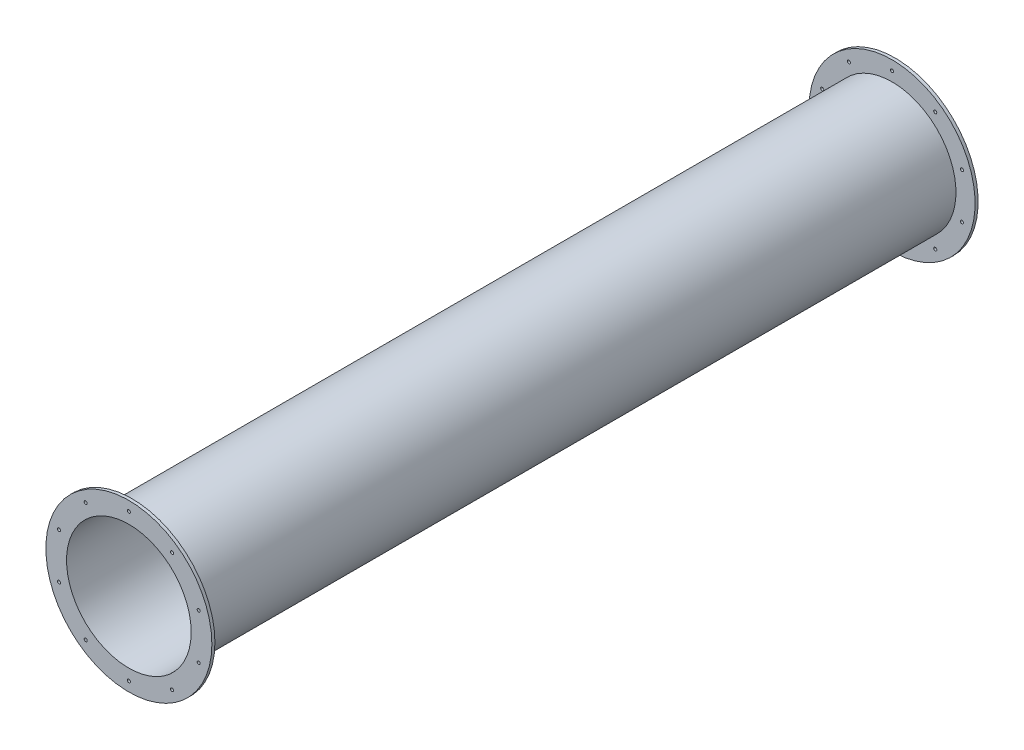
ISO-10303-21;
HEADER;
FILE_DESCRIPTION(('STEP AP214'),'2;1');
FILE_NAME('part.step','',(''),(''),'','','');
FILE_SCHEMA(('AUTOMOTIVE_DESIGN { 1 0 10303 214 1 1 1 1 }'));
ENDSEC;
DATA;
#1=APPLICATION_CONTEXT('core data for automotive mechanical design processes');
#2=APPLICATION_PROTOCOL_DEFINITION('international standard','automotive_design',2000,#1);
#3=PRODUCT_CONTEXT('',#1,'mechanical');
#4=PRODUCT('Part','Part','',(#3));
#5=PRODUCT_RELATED_PRODUCT_CATEGORY('part','',(#4));
#6=PRODUCT_DEFINITION_FORMATION('','',#4);
#7=PRODUCT_DEFINITION_CONTEXT('part definition',#1,'design');
#8=PRODUCT_DEFINITION('design','',#6,#7);
#9=PRODUCT_DEFINITION_SHAPE('','',#8);
#10=(LENGTH_UNIT() NAMED_UNIT(*) SI_UNIT(.MILLI.,.METRE.));
#11=(NAMED_UNIT(*) PLANE_ANGLE_UNIT() SI_UNIT($,.RADIAN.));
#12=(NAMED_UNIT(*) SI_UNIT($,.STERADIAN.) SOLID_ANGLE_UNIT());
#13=UNCERTAINTY_MEASURE_WITH_UNIT(LENGTH_MEASURE(1.E-05),#10,'distance_accuracy_value','');
#14=(GEOMETRIC_REPRESENTATION_CONTEXT(3) GLOBAL_UNCERTAINTY_ASSIGNED_CONTEXT((#13)) GLOBAL_UNIT_ASSIGNED_CONTEXT((#10,
#11,#12)) REPRESENTATION_CONTEXT('',''));
#15=CARTESIAN_POINT('',(0.,0.,0.));
#16=DIRECTION('',(0.,0.,1.));
#17=DIRECTION('',(1.,0.,0.));
#18=AXIS2_PLACEMENT_3D('',#15,#16,#17);
#19=CARTESIAN_POINT('',(0.,0.,3000.));
#20=DIRECTION('',(0.,0.,-1.));
#21=DIRECTION('',(-1.,0.,0.));
#22=AXIS2_PLACEMENT_3D('',#19,#20,#21);
#23=CYLINDRICAL_SURFACE('',#22,250.);
#24=CARTESIAN_POINT('',(0.,0.,2988.));
#25=DIRECTION('',(0.,0.,1.));
#26=DIRECTION('',(1.,0.,0.));
#27=AXIS2_PLACEMENT_3D('',#24,#25,#26);
#28=CIRCLE('',#27,250.);
#29=CARTESIAN_POINT('',(250.,0.,2988.));
#30=VERTEX_POINT('',#29);
#31=EDGE_CURVE('E38',#30,#30,#28,.T.);
#32=ORIENTED_EDGE('',*,*,#31,.F.);
#33=EDGE_LOOP('',(#32));
#34=FACE_BOUND('',#33,.T.);
#35=CARTESIAN_POINT('',(0.,0.,12.));
#36=DIRECTION('',(0.,0.,-1.));
#37=DIRECTION('',(-1.,0.,0.));
#38=AXIS2_PLACEMENT_3D('',#35,#36,#37);
#39=CIRCLE('',#38,250.);
#40=CARTESIAN_POINT('',(-250.,0.,12.));
#41=VERTEX_POINT('',#40);
#42=EDGE_CURVE('E10',#41,#41,#39,.T.);
#43=ORIENTED_EDGE('',*,*,#42,.F.);
#44=EDGE_LOOP('',(#43));
#45=FACE_BOUND('',#44,.T.);
#46=ADVANCED_FACE('F31',(#34,#45),#23,.T.);
#47=CARTESIAN_POINT('',(0.,0.,3000.));
#48=DIRECTION('',(0.,0.,1.));
#49=DIRECTION('',(1.,0.,0.));
#50=AXIS2_PLACEMENT_3D('',#47,#48,#49);
#51=PLANE('',#50);
#52=CARTESIAN_POINT('',(0.,287.5,3000.));
#53=DIRECTION('',(0.,0.,1.));
#54=DIRECTION('',(1.,0.,0.));
#55=AXIS2_PLACEMENT_3D('',#52,#53,#54);
#56=CIRCLE('',#55,6.00000000000001);
#57=CARTESIAN_POINT('',(6.00000000000001,287.5,3000.));
#58=VERTEX_POINT('',#57);
#59=EDGE_CURVE('E255',#58,#58,#56,.T.);
#60=ORIENTED_EDGE('',*,*,#59,.F.);
#61=EDGE_LOOP('',(#60));
#62=FACE_BOUND('',#61,.T.);
#63=CARTESIAN_POINT('',(-168.988260034086,232.592385882797,3000.));
#64=DIRECTION('',(0.,0.,1.));
#65=DIRECTION('',(1.,0.,0.));
#66=AXIS2_PLACEMENT_3D('',#63,#64,#65);
#67=CIRCLE('',#66,6.00000000000002);
#68=CARTESIAN_POINT('',(-162.988260034086,232.592385882797,3000.));
#69=VERTEX_POINT('',#68);
#70=EDGE_CURVE('E263',#69,#69,#67,.T.);
#71=ORIENTED_EDGE('',*,*,#70,.F.);
#72=EDGE_LOOP('',(#71));
#73=FACE_BOUND('',#72,.T.);
#74=CARTESIAN_POINT('',(-273.428748434856,88.8423858827975,3000.));
#75=DIRECTION('',(0.,0.,1.));
#76=DIRECTION('',(1.,0.,0.));
#77=AXIS2_PLACEMENT_3D('',#74,#75,#76);
#78=CIRCLE('',#77,5.99999999999999);
#79=CARTESIAN_POINT('',(-267.428748434856,88.8423858827975,3000.));
#80=VERTEX_POINT('',#79);
#81=EDGE_CURVE('E304',#80,#80,#78,.T.);
#82=ORIENTED_EDGE('',*,*,#81,.F.);
#83=EDGE_LOOP('',(#82));
#84=FACE_BOUND('',#83,.T.);
#85=CARTESIAN_POINT('',(-273.428748434856,-88.8423858827971,3000.));
#86=DIRECTION('',(0.,0.,1.));
#87=DIRECTION('',(1.,0.,0.));
#88=AXIS2_PLACEMENT_3D('',#85,#86,#87);
#89=CIRCLE('',#88,5.99999999999999);
#90=CARTESIAN_POINT('',(-267.428748434856,-88.8423858827971,3000.));
#91=VERTEX_POINT('',#90);
#92=EDGE_CURVE('E298',#91,#91,#89,.T.);
#93=ORIENTED_EDGE('',*,*,#92,.F.);
#94=EDGE_LOOP('',(#93));
#95=FACE_BOUND('',#94,.T.);
#96=CARTESIAN_POINT('',(-168.988260034086,-232.592385882797,3000.));
#97=DIRECTION('',(0.,0.,1.));
#98=DIRECTION('',(1.,0.,0.));
#99=AXIS2_PLACEMENT_3D('',#96,#97,#98);
#100=CIRCLE('',#99,6.00000000000002);
#101=CARTESIAN_POINT('',(-162.988260034086,-232.592385882797,3000.));
#102=VERTEX_POINT('',#101);
#103=EDGE_CURVE('E292',#102,#102,#100,.T.);
#104=ORIENTED_EDGE('',*,*,#103,.F.);
#105=EDGE_LOOP('',(#104));
#106=FACE_BOUND('',#105,.T.);
#107=CARTESIAN_POINT('',(2.19318203764714E-13,-287.499999999999,3000.));
#108=DIRECTION('',(0.,0.,1.));
#109=DIRECTION('',(1.,0.,0.));
#110=AXIS2_PLACEMENT_3D('',#107,#108,#109);
#111=CIRCLE('',#110,6.00000000000001);
#112=CARTESIAN_POINT('',(6.00000000000023,-287.499999999999,3000.));
#113=VERTEX_POINT('',#112);
#114=EDGE_CURVE('E286',#113,#113,#111,.T.);
#115=ORIENTED_EDGE('',*,*,#114,.F.);
#116=EDGE_LOOP('',(#115));
#117=FACE_BOUND('',#116,.T.);
#118=CARTESIAN_POINT('',(168.988260034086,-232.592385882797,3000.));
#119=DIRECTION('',(0.,0.,1.));
#120=DIRECTION('',(1.,0.,0.));
#121=AXIS2_PLACEMENT_3D('',#118,#119,#120);
#122=CIRCLE('',#121,6.00000000000002);
#123=CARTESIAN_POINT('',(174.988260034086,-232.592385882797,3000.));
#124=VERTEX_POINT('',#123);
#125=EDGE_CURVE('E280',#124,#124,#122,.T.);
#126=ORIENTED_EDGE('',*,*,#125,.F.);
#127=EDGE_LOOP('',(#126));
#128=FACE_BOUND('',#127,.T.);
#129=CARTESIAN_POINT('',(273.428748434856,-88.8423858827968,3000.));
#130=DIRECTION('',(0.,0.,1.));
#131=DIRECTION('',(1.,0.,0.));
#132=AXIS2_PLACEMENT_3D('',#129,#130,#131);
#133=CIRCLE('',#132,5.99999999999999);
#134=CARTESIAN_POINT('',(279.428748434856,-88.8423858827968,3000.));
#135=VERTEX_POINT('',#134);
#136=EDGE_CURVE('E274',#135,#135,#133,.T.);
#137=ORIENTED_EDGE('',*,*,#136,.F.);
#138=EDGE_LOOP('',(#137));
#139=FACE_BOUND('',#138,.T.);
#140=CARTESIAN_POINT('',(273.428748434856,88.8423858827977,3000.));
#141=DIRECTION('',(0.,0.,1.));
#142=DIRECTION('',(1.,0.,0.));
#143=AXIS2_PLACEMENT_3D('',#140,#141,#142);
#144=CIRCLE('',#143,5.99999999999999);
#145=CARTESIAN_POINT('',(279.428748434856,88.8423858827977,3000.));
#146=VERTEX_POINT('',#145);
#147=EDGE_CURVE('E268',#146,#146,#144,.T.);
#148=ORIENTED_EDGE('',*,*,#147,.F.);
#149=EDGE_LOOP('',(#148));
#150=FACE_BOUND('',#149,.T.);
#151=CARTESIAN_POINT('',(168.988260034086,232.592385882797,3000.));
#152=DIRECTION('',(0.,0.,1.));
#153=DIRECTION('',(1.,0.,0.));
#154=AXIS2_PLACEMENT_3D('',#151,#152,#153);
#155=CIRCLE('',#154,6.00000000000002);
#156=CARTESIAN_POINT('',(174.988260034086,232.592385882797,3000.));
#157=VERTEX_POINT('',#156);
#158=EDGE_CURVE('E256',#157,#157,#155,.T.);
#159=ORIENTED_EDGE('',*,*,#158,.F.);
#160=EDGE_LOOP('',(#159));
#161=FACE_BOUND('',#160,.T.);
#162=CARTESIAN_POINT('',(0.,0.,3000.));
#163=DIRECTION('',(0.,0.,1.));
#164=DIRECTION('',(1.,0.,0.));
#165=AXIS2_PLACEMENT_3D('',#162,#163,#164);
#166=CIRCLE('',#165,244.);
#167=CARTESIAN_POINT('',(244.,0.,3000.));
#168=VERTEX_POINT('',#167);
#169=EDGE_CURVE('E43',#168,#168,#166,.T.);
#170=ORIENTED_EDGE('',*,*,#169,.F.);
#171=EDGE_LOOP('',(#170));
#172=FACE_BOUND('',#171,.T.);
#173=CARTESIAN_POINT('',(0.,0.,3000.));
#174=DIRECTION('',(0.,0.,1.));
#175=DIRECTION('',(1.,0.,0.));
#176=AXIS2_PLACEMENT_3D('',#173,#174,#175);
#177=CIRCLE('',#176,325.);
#178=CARTESIAN_POINT('',(325.,0.,3000.));
#179=VERTEX_POINT('',#178);
#180=EDGE_CURVE('E100',#179,#179,#177,.T.);
#181=ORIENTED_EDGE('',*,*,#180,.T.);
#182=EDGE_LOOP('',(#181));
#183=FACE_BOUND('',#182,.T.);
#184=ADVANCED_FACE('F128',(#62,#73,#84,#95,#106,#117,#128,#139,#150,#161,#172,#183),#51,.T.);
#185=CARTESIAN_POINT('',(0.,0.,0.));
#186=DIRECTION('',(0.,0.,1.));
#187=DIRECTION('',(1.,0.,0.));
#188=AXIS2_PLACEMENT_3D('',#185,#186,#187);
#189=PLANE('',#188);
#190=CARTESIAN_POINT('',(0.,287.5,0.));
#191=DIRECTION('',(0.,0.,1.));
#192=DIRECTION('',(1.,0.,0.));
#193=AXIS2_PLACEMENT_3D('',#190,#191,#192);
#194=CIRCLE('',#193,6.00000000000001);
#195=CARTESIAN_POINT('',(6.00000000000001,287.5,0.));
#196=VERTEX_POINT('',#195);
#197=EDGE_CURVE('E51',#196,#196,#194,.T.);
#198=ORIENTED_EDGE('',*,*,#197,.T.);
#199=EDGE_LOOP('',(#198));
#200=FACE_BOUND('',#199,.T.);
#201=CARTESIAN_POINT('',(-168.988260034086,232.592385882797,0.));
#202=DIRECTION('',(0.,0.,1.));
#203=DIRECTION('',(1.,0.,0.));
#204=AXIS2_PLACEMENT_3D('',#201,#202,#203);
#205=CIRCLE('',#204,6.00000000000002);
#206=CARTESIAN_POINT('',(-162.988260034086,232.592385882797,0.));
#207=VERTEX_POINT('',#206);
#208=EDGE_CURVE('E307',#207,#207,#205,.T.);
#209=ORIENTED_EDGE('',*,*,#208,.T.);
#210=EDGE_LOOP('',(#209));
#211=FACE_BOUND('',#210,.T.);
#212=CARTESIAN_POINT('',(-273.428748434856,88.8423858827975,0.));
#213=DIRECTION('',(0.,0.,1.));
#214=DIRECTION('',(1.,0.,0.));
#215=AXIS2_PLACEMENT_3D('',#212,#213,#214);
#216=CIRCLE('',#215,5.99999999999999);
#217=CARTESIAN_POINT('',(-267.428748434856,88.8423858827975,0.));
#218=VERTEX_POINT('',#217);
#219=EDGE_CURVE('E301',#218,#218,#216,.T.);
#220=ORIENTED_EDGE('',*,*,#219,.T.);
#221=EDGE_LOOP('',(#220));
#222=FACE_BOUND('',#221,.T.);
#223=CARTESIAN_POINT('',(-273.428748434856,-88.8423858827971,0.));
#224=DIRECTION('',(0.,0.,1.));
#225=DIRECTION('',(1.,0.,0.));
#226=AXIS2_PLACEMENT_3D('',#223,#224,#225);
#227=CIRCLE('',#226,5.99999999999999);
#228=CARTESIAN_POINT('',(-267.428748434856,-88.8423858827971,0.));
#229=VERTEX_POINT('',#228);
#230=EDGE_CURVE('E295',#229,#229,#227,.T.);
#231=ORIENTED_EDGE('',*,*,#230,.T.);
#232=EDGE_LOOP('',(#231));
#233=FACE_BOUND('',#232,.T.);
#234=CARTESIAN_POINT('',(-168.988260034086,-232.592385882797,0.));
#235=DIRECTION('',(0.,0.,1.));
#236=DIRECTION('',(1.,0.,0.));
#237=AXIS2_PLACEMENT_3D('',#234,#235,#236);
#238=CIRCLE('',#237,6.00000000000002);
#239=CARTESIAN_POINT('',(-162.988260034086,-232.592385882797,0.));
#240=VERTEX_POINT('',#239);
#241=EDGE_CURVE('E289',#240,#240,#238,.T.);
#242=ORIENTED_EDGE('',*,*,#241,.T.);
#243=EDGE_LOOP('',(#242));
#244=FACE_BOUND('',#243,.T.);
#245=CARTESIAN_POINT('',(2.19318203764714E-13,-287.499999999999,0.));
#246=DIRECTION('',(0.,0.,1.));
#247=DIRECTION('',(1.,0.,0.));
#248=AXIS2_PLACEMENT_3D('',#245,#246,#247);
#249=CIRCLE('',#248,6.00000000000001);
#250=CARTESIAN_POINT('',(6.00000000000023,-287.499999999999,0.));
#251=VERTEX_POINT('',#250);
#252=EDGE_CURVE('E283',#251,#251,#249,.T.);
#253=ORIENTED_EDGE('',*,*,#252,.T.);
#254=EDGE_LOOP('',(#253));
#255=FACE_BOUND('',#254,.T.);
#256=CARTESIAN_POINT('',(168.988260034086,-232.592385882797,0.));
#257=DIRECTION('',(0.,0.,1.));
#258=DIRECTION('',(1.,0.,0.));
#259=AXIS2_PLACEMENT_3D('',#256,#257,#258);
#260=CIRCLE('',#259,6.00000000000002);
#261=CARTESIAN_POINT('',(174.988260034086,-232.592385882797,0.));
#262=VERTEX_POINT('',#261);
#263=EDGE_CURVE('E277',#262,#262,#260,.T.);
#264=ORIENTED_EDGE('',*,*,#263,.T.);
#265=EDGE_LOOP('',(#264));
#266=FACE_BOUND('',#265,.T.);
#267=CARTESIAN_POINT('',(273.428748434856,-88.8423858827968,0.));
#268=DIRECTION('',(0.,0.,1.));
#269=DIRECTION('',(1.,0.,0.));
#270=AXIS2_PLACEMENT_3D('',#267,#268,#269);
#271=CIRCLE('',#270,5.99999999999999);
#272=CARTESIAN_POINT('',(279.428748434856,-88.8423858827968,0.));
#273=VERTEX_POINT('',#272);
#274=EDGE_CURVE('E271',#273,#273,#271,.T.);
#275=ORIENTED_EDGE('',*,*,#274,.T.);
#276=EDGE_LOOP('',(#275));
#277=FACE_BOUND('',#276,.T.);
#278=CARTESIAN_POINT('',(273.428748434856,88.8423858827977,0.));
#279=DIRECTION('',(0.,0.,1.));
#280=DIRECTION('',(1.,0.,0.));
#281=AXIS2_PLACEMENT_3D('',#278,#279,#280);
#282=CIRCLE('',#281,5.99999999999999);
#283=CARTESIAN_POINT('',(279.428748434856,88.8423858827977,0.));
#284=VERTEX_POINT('',#283);
#285=EDGE_CURVE('E260',#284,#284,#282,.T.);
#286=ORIENTED_EDGE('',*,*,#285,.T.);
#287=EDGE_LOOP('',(#286));
#288=FACE_BOUND('',#287,.T.);
#289=CARTESIAN_POINT('',(168.988260034086,232.592385882797,0.));
#290=DIRECTION('',(0.,0.,1.));
#291=DIRECTION('',(1.,0.,0.));
#292=AXIS2_PLACEMENT_3D('',#289,#290,#291);
#293=CIRCLE('',#292,6.00000000000002);
#294=CARTESIAN_POINT('',(174.988260034086,232.592385882797,0.));
#295=VERTEX_POINT('',#294);
#296=EDGE_CURVE('E253',#295,#295,#293,.T.);
#297=ORIENTED_EDGE('',*,*,#296,.T.);
#298=EDGE_LOOP('',(#297));
#299=FACE_BOUND('',#298,.T.);
#300=CARTESIAN_POINT('',(0.,0.,0.));
#301=DIRECTION('',(0.,0.,1.));
#302=DIRECTION('',(1.,0.,0.));
#303=AXIS2_PLACEMENT_3D('',#300,#301,#302);
#304=CIRCLE('',#303,244.);
#305=CARTESIAN_POINT('',(244.,0.,0.));
#306=VERTEX_POINT('',#305);
#307=EDGE_CURVE('E106',#306,#306,#304,.T.);
#308=ORIENTED_EDGE('',*,*,#307,.T.);
#309=EDGE_LOOP('',(#308));
#310=FACE_BOUND('',#309,.T.);
#311=CARTESIAN_POINT('',(0.,0.,0.));
#312=DIRECTION('',(0.,0.,-1.));
#313=DIRECTION('',(-1.,0.,0.));
#314=AXIS2_PLACEMENT_3D('',#311,#312,#313);
#315=CIRCLE('',#314,325.);
#316=CARTESIAN_POINT('',(-325.,0.,0.));
#317=VERTEX_POINT('',#316);
#318=EDGE_CURVE('E96',#317,#317,#315,.T.);
#319=ORIENTED_EDGE('',*,*,#318,.T.);
#320=EDGE_LOOP('',(#319));
#321=FACE_BOUND('',#320,.T.);
#322=ADVANCED_FACE('F113',(#200,#211,#222,#233,#244,#255,#266,#277,#288,#299,#310,#321),#189,.F.);
#323=CARTESIAN_POINT('',(0.,0.,3000.));
#324=DIRECTION('',(0.,0.,-1.));
#325=DIRECTION('',(-1.,0.,0.));
#326=AXIS2_PLACEMENT_3D('',#323,#324,#325);
#327=CYLINDRICAL_SURFACE('',#326,244.);
#328=ORIENTED_EDGE('',*,*,#169,.T.);
#329=EDGE_LOOP('',(#328));
#330=FACE_BOUND('',#329,.T.);
#331=ORIENTED_EDGE('',*,*,#307,.F.);
#332=EDGE_LOOP('',(#331));
#333=FACE_BOUND('',#332,.T.);
#334=ADVANCED_FACE('F116',(#330,#333),#327,.F.);
#335=CARTESIAN_POINT('',(0.,0.,2988.));
#336=DIRECTION('',(0.,0.,1.));
#337=DIRECTION('',(1.,0.,0.));
#338=AXIS2_PLACEMENT_3D('',#335,#336,#337);
#339=CYLINDRICAL_SURFACE('',#338,325.);
#340=CARTESIAN_POINT('',(0.,0.,2988.));
#341=DIRECTION('',(0.,0.,1.));
#342=DIRECTION('',(1.,0.,0.));
#343=AXIS2_PLACEMENT_3D('',#340,#341,#342);
#344=CIRCLE('',#343,325.);
#345=CARTESIAN_POINT('',(325.,0.,2988.));
#346=VERTEX_POINT('',#345);
#347=EDGE_CURVE('E103',#346,#346,#344,.T.);
#348=ORIENTED_EDGE('',*,*,#347,.T.);
#349=EDGE_LOOP('',(#348));
#350=FACE_BOUND('',#349,.T.);
#351=ORIENTED_EDGE('',*,*,#180,.F.);
#352=EDGE_LOOP('',(#351));
#353=FACE_BOUND('',#352,.T.);
#354=ADVANCED_FACE('F118',(#350,#353),#339,.T.);
#355=CARTESIAN_POINT('',(0.,0.,2988.));
#356=DIRECTION('',(0.,0.,1.));
#357=DIRECTION('',(1.,0.,0.));
#358=AXIS2_PLACEMENT_3D('',#355,#356,#357);
#359=PLANE('',#358);
#360=CARTESIAN_POINT('',(0.,287.5,2988.));
#361=DIRECTION('',(0.,0.,1.));
#362=DIRECTION('',(1.,0.,0.));
#363=AXIS2_PLACEMENT_3D('',#360,#361,#362);
#364=CIRCLE('',#363,6.00000000000001);
#365=CARTESIAN_POINT('',(6.00000000000001,287.5,2988.));
#366=VERTEX_POINT('',#365);
#367=EDGE_CURVE('E93',#366,#366,#364,.T.);
#368=ORIENTED_EDGE('',*,*,#367,.T.);
#369=EDGE_LOOP('',(#368));
#370=FACE_BOUND('',#369,.T.);
#371=CARTESIAN_POINT('',(-168.988260034086,232.592385882797,2988.));
#372=DIRECTION('',(0.,0.,1.));
#373=DIRECTION('',(1.,0.,0.));
#374=AXIS2_PLACEMENT_3D('',#371,#372,#373);
#375=CIRCLE('',#374,6.00000000000002);
#376=CARTESIAN_POINT('',(-162.988260034086,232.592385882797,2988.));
#377=VERTEX_POINT('',#376);
#378=EDGE_CURVE('E81',#377,#377,#375,.T.);
#379=ORIENTED_EDGE('',*,*,#378,.T.);
#380=EDGE_LOOP('',(#379));
#381=FACE_BOUND('',#380,.T.);
#382=CARTESIAN_POINT('',(-273.428748434856,88.8423858827975,2988.));
#383=DIRECTION('',(0.,0.,1.));
#384=DIRECTION('',(1.,0.,0.));
#385=AXIS2_PLACEMENT_3D('',#382,#383,#384);
#386=CIRCLE('',#385,5.99999999999999);
#387=CARTESIAN_POINT('',(-267.428748434856,88.8423858827975,2988.));
#388=VERTEX_POINT('',#387);
#389=EDGE_CURVE('E78',#388,#388,#386,.T.);
#390=ORIENTED_EDGE('',*,*,#389,.T.);
#391=EDGE_LOOP('',(#390));
#392=FACE_BOUND('',#391,.T.);
#393=CARTESIAN_POINT('',(-273.428748434856,-88.8423858827971,2988.));
#394=DIRECTION('',(0.,0.,1.));
#395=DIRECTION('',(1.,0.,0.));
#396=AXIS2_PLACEMENT_3D('',#393,#394,#395);
#397=CIRCLE('',#396,5.99999999999999);
#398=CARTESIAN_POINT('',(-267.428748434856,-88.8423858827971,2988.));
#399=VERTEX_POINT('',#398);
#400=EDGE_CURVE('E75',#399,#399,#397,.T.);
#401=ORIENTED_EDGE('',*,*,#400,.T.);
#402=EDGE_LOOP('',(#401));
#403=FACE_BOUND('',#402,.T.);
#404=CARTESIAN_POINT('',(-168.988260034086,-232.592385882797,2988.));
#405=DIRECTION('',(0.,0.,1.));
#406=DIRECTION('',(1.,0.,0.));
#407=AXIS2_PLACEMENT_3D('',#404,#405,#406);
#408=CIRCLE('',#407,6.00000000000002);
#409=CARTESIAN_POINT('',(-162.988260034086,-232.592385882797,2988.));
#410=VERTEX_POINT('',#409);
#411=EDGE_CURVE('E71',#410,#410,#408,.T.);
#412=ORIENTED_EDGE('',*,*,#411,.T.);
#413=EDGE_LOOP('',(#412));
#414=FACE_BOUND('',#413,.T.);
#415=CARTESIAN_POINT('',(2.19318203764714E-13,-287.499999999999,2988.));
#416=DIRECTION('',(0.,0.,1.));
#417=DIRECTION('',(1.,0.,0.));
#418=AXIS2_PLACEMENT_3D('',#415,#416,#417);
#419=CIRCLE('',#418,6.00000000000001);
#420=CARTESIAN_POINT('',(6.00000000000023,-287.499999999999,2988.));
#421=VERTEX_POINT('',#420);
#422=EDGE_CURVE('E67',#421,#421,#419,.T.);
#423=ORIENTED_EDGE('',*,*,#422,.T.);
#424=EDGE_LOOP('',(#423));
#425=FACE_BOUND('',#424,.T.);
#426=CARTESIAN_POINT('',(168.988260034086,-232.592385882797,2988.));
#427=DIRECTION('',(0.,0.,1.));
#428=DIRECTION('',(1.,0.,0.));
#429=AXIS2_PLACEMENT_3D('',#426,#427,#428);
#430=CIRCLE('',#429,6.00000000000002);
#431=CARTESIAN_POINT('',(174.988260034086,-232.592385882797,2988.));
#432=VERTEX_POINT('',#431);
#433=EDGE_CURVE('E63',#432,#432,#430,.T.);
#434=ORIENTED_EDGE('',*,*,#433,.T.);
#435=EDGE_LOOP('',(#434));
#436=FACE_BOUND('',#435,.T.);
#437=CARTESIAN_POINT('',(273.428748434856,-88.8423858827968,2988.));
#438=DIRECTION('',(0.,0.,1.));
#439=DIRECTION('',(1.,0.,0.));
#440=AXIS2_PLACEMENT_3D('',#437,#438,#439);
#441=CIRCLE('',#440,5.99999999999999);
#442=CARTESIAN_POINT('',(279.428748434856,-88.8423858827968,2988.));
#443=VERTEX_POINT('',#442);
#444=EDGE_CURVE('E59',#443,#443,#441,.T.);
#445=ORIENTED_EDGE('',*,*,#444,.T.);
#446=EDGE_LOOP('',(#445));
#447=FACE_BOUND('',#446,.T.);
#448=CARTESIAN_POINT('',(273.428748434856,88.8423858827977,2988.));
#449=DIRECTION('',(0.,0.,1.));
#450=DIRECTION('',(1.,0.,0.));
#451=AXIS2_PLACEMENT_3D('',#448,#449,#450);
#452=CIRCLE('',#451,5.99999999999999);
#453=CARTESIAN_POINT('',(279.428748434856,88.8423858827977,2988.));
#454=VERTEX_POINT('',#453);
#455=EDGE_CURVE('E55',#454,#454,#452,.T.);
#456=ORIENTED_EDGE('',*,*,#455,.T.);
#457=EDGE_LOOP('',(#456));
#458=FACE_BOUND('',#457,.T.);
#459=CARTESIAN_POINT('',(168.988260034086,232.592385882797,2988.));
#460=DIRECTION('',(0.,0.,1.));
#461=DIRECTION('',(1.,0.,0.));
#462=AXIS2_PLACEMENT_3D('',#459,#460,#461);
#463=CIRCLE('',#462,6.00000000000002);
#464=CARTESIAN_POINT('',(174.988260034086,232.592385882797,2988.));
#465=VERTEX_POINT('',#464);
#466=EDGE_CURVE('E50',#465,#465,#463,.T.);
#467=ORIENTED_EDGE('',*,*,#466,.T.);
#468=EDGE_LOOP('',(#467));
#469=FACE_BOUND('',#468,.T.);
#470=ORIENTED_EDGE('',*,*,#31,.T.);
#471=EDGE_LOOP('',(#470));
#472=FACE_BOUND('',#471,.T.);
#473=ORIENTED_EDGE('',*,*,#347,.F.);
#474=EDGE_LOOP('',(#473));
#475=FACE_BOUND('',#474,.T.);
#476=ADVANCED_FACE('F125',(#370,#381,#392,#403,#414,#425,#436,#447,#458,#469,#472,#475),#359,.F.);
#477=CARTESIAN_POINT('',(0.,0.,12.));
#478=DIRECTION('',(0.,0.,-1.));
#479=DIRECTION('',(-1.,0.,0.));
#480=AXIS2_PLACEMENT_3D('',#477,#478,#479);
#481=CYLINDRICAL_SURFACE('',#480,325.);
#482=CARTESIAN_POINT('',(0.,0.,12.));
#483=DIRECTION('',(0.,0.,-1.));
#484=DIRECTION('',(-1.,0.,0.));
#485=AXIS2_PLACEMENT_3D('',#482,#483,#484);
#486=CIRCLE('',#485,325.);
#487=CARTESIAN_POINT('',(-325.,0.,12.));
#488=VERTEX_POINT('',#487);
#489=EDGE_CURVE('E97',#488,#488,#486,.T.);
#490=ORIENTED_EDGE('',*,*,#489,.T.);
#491=EDGE_LOOP('',(#490));
#492=FACE_BOUND('',#491,.T.);
#493=ORIENTED_EDGE('',*,*,#318,.F.);
#494=EDGE_LOOP('',(#493));
#495=FACE_BOUND('',#494,.T.);
#496=ADVANCED_FACE('F142',(#492,#495),#481,.T.);
#497=CARTESIAN_POINT('',(0.,0.,12.));
#498=DIRECTION('',(0.,0.,-1.));
#499=DIRECTION('',(-1.,0.,0.));
#500=AXIS2_PLACEMENT_3D('',#497,#498,#499);
#501=PLANE('',#500);
#502=CARTESIAN_POINT('',(0.,287.5,12.));
#503=DIRECTION('',(0.,0.,-1.));
#504=DIRECTION('',(-1.,0.,0.));
#505=AXIS2_PLACEMENT_3D('',#502,#503,#504);
#506=CIRCLE('',#505,6.00000000000001);
#507=CARTESIAN_POINT('',(-6.00000000000001,287.5,12.));
#508=VERTEX_POINT('',#507);
#509=EDGE_CURVE('E34',#508,#508,#506,.T.);
#510=ORIENTED_EDGE('',*,*,#509,.T.);
#511=EDGE_LOOP('',(#510));
#512=FACE_BOUND('',#511,.T.);
#513=CARTESIAN_POINT('',(-168.988260034086,232.592385882797,12.));
#514=DIRECTION('',(0.,0.,-1.));
#515=DIRECTION('',(-1.,0.,0.));
#516=AXIS2_PLACEMENT_3D('',#513,#514,#515);
#517=CIRCLE('',#516,6.00000000000002);
#518=CARTESIAN_POINT('',(-174.988260034086,232.592385882797,12.));
#519=VERTEX_POINT('',#518);
#520=EDGE_CURVE('E79',#519,#519,#517,.T.);
#521=ORIENTED_EDGE('',*,*,#520,.T.);
#522=EDGE_LOOP('',(#521));
#523=FACE_BOUND('',#522,.T.);
#524=CARTESIAN_POINT('',(-273.428748434856,88.8423858827975,12.));
#525=DIRECTION('',(0.,0.,-1.));
#526=DIRECTION('',(-1.,0.,0.));
#527=AXIS2_PLACEMENT_3D('',#524,#525,#526);
#528=CIRCLE('',#527,5.99999999999999);
#529=CARTESIAN_POINT('',(-279.428748434856,88.8423858827975,12.));
#530=VERTEX_POINT('',#529);
#531=EDGE_CURVE('E76',#530,#530,#528,.T.);
#532=ORIENTED_EDGE('',*,*,#531,.T.);
#533=EDGE_LOOP('',(#532));
#534=FACE_BOUND('',#533,.T.);
#535=CARTESIAN_POINT('',(-273.428748434856,-88.8423858827971,12.));
#536=DIRECTION('',(0.,0.,-1.));
#537=DIRECTION('',(-1.,0.,0.));
#538=AXIS2_PLACEMENT_3D('',#535,#536,#537);
#539=CIRCLE('',#538,5.99999999999999);
#540=CARTESIAN_POINT('',(-279.428748434856,-88.8423858827971,12.));
#541=VERTEX_POINT('',#540);
#542=EDGE_CURVE('E72',#541,#541,#539,.T.);
#543=ORIENTED_EDGE('',*,*,#542,.T.);
#544=EDGE_LOOP('',(#543));
#545=FACE_BOUND('',#544,.T.);
#546=CARTESIAN_POINT('',(-168.988260034086,-232.592385882797,12.));
#547=DIRECTION('',(0.,0.,-1.));
#548=DIRECTION('',(-1.,0.,0.));
#549=AXIS2_PLACEMENT_3D('',#546,#547,#548);
#550=CIRCLE('',#549,6.00000000000002);
#551=CARTESIAN_POINT('',(-174.988260034086,-232.592385882797,12.));
#552=VERTEX_POINT('',#551);
#553=EDGE_CURVE('E68',#552,#552,#550,.T.);
#554=ORIENTED_EDGE('',*,*,#553,.T.);
#555=EDGE_LOOP('',(#554));
#556=FACE_BOUND('',#555,.T.);
#557=CARTESIAN_POINT('',(2.19318203764714E-13,-287.499999999999,12.));
#558=DIRECTION('',(0.,0.,-1.));
#559=DIRECTION('',(-1.,0.,0.));
#560=AXIS2_PLACEMENT_3D('',#557,#558,#559);
#561=CIRCLE('',#560,6.00000000000001);
#562=CARTESIAN_POINT('',(-5.99999999999979,-287.499999999999,12.));
#563=VERTEX_POINT('',#562);
#564=EDGE_CURVE('E64',#563,#563,#561,.T.);
#565=ORIENTED_EDGE('',*,*,#564,.T.);
#566=EDGE_LOOP('',(#565));
#567=FACE_BOUND('',#566,.T.);
#568=CARTESIAN_POINT('',(168.988260034086,-232.592385882797,12.));
#569=DIRECTION('',(0.,0.,-1.));
#570=DIRECTION('',(-1.,0.,0.));
#571=AXIS2_PLACEMENT_3D('',#568,#569,#570);
#572=CIRCLE('',#571,6.00000000000002);
#573=CARTESIAN_POINT('',(162.988260034086,-232.592385882797,12.));
#574=VERTEX_POINT('',#573);
#575=EDGE_CURVE('E60',#574,#574,#572,.T.);
#576=ORIENTED_EDGE('',*,*,#575,.T.);
#577=EDGE_LOOP('',(#576));
#578=FACE_BOUND('',#577,.T.);
#579=CARTESIAN_POINT('',(273.428748434856,-88.8423858827968,12.));
#580=DIRECTION('',(0.,0.,-1.));
#581=DIRECTION('',(-1.,0.,0.));
#582=AXIS2_PLACEMENT_3D('',#579,#580,#581);
#583=CIRCLE('',#582,5.99999999999999);
#584=CARTESIAN_POINT('',(267.428748434856,-88.8423858827968,12.));
#585=VERTEX_POINT('',#584);
#586=EDGE_CURVE('E56',#585,#585,#583,.T.);
#587=ORIENTED_EDGE('',*,*,#586,.T.);
#588=EDGE_LOOP('',(#587));
#589=FACE_BOUND('',#588,.T.);
#590=CARTESIAN_POINT('',(273.428748434856,88.8423858827977,12.));
#591=DIRECTION('',(0.,0.,-1.));
#592=DIRECTION('',(-1.,0.,0.));
#593=AXIS2_PLACEMENT_3D('',#590,#591,#592);
#594=CIRCLE('',#593,5.99999999999999);
#595=CARTESIAN_POINT('',(267.428748434856,88.8423858827977,12.));
#596=VERTEX_POINT('',#595);
#597=EDGE_CURVE('E52',#596,#596,#594,.T.);
#598=ORIENTED_EDGE('',*,*,#597,.T.);
#599=EDGE_LOOP('',(#598));
#600=FACE_BOUND('',#599,.T.);
#601=CARTESIAN_POINT('',(168.988260034086,232.592385882797,12.));
#602=DIRECTION('',(0.,0.,-1.));
#603=DIRECTION('',(-1.,0.,0.));
#604=AXIS2_PLACEMENT_3D('',#601,#602,#603);
#605=CIRCLE('',#604,6.00000000000002);
#606=CARTESIAN_POINT('',(162.988260034086,232.592385882797,12.));
#607=VERTEX_POINT('',#606);
#608=EDGE_CURVE('E47',#607,#607,#605,.T.);
#609=ORIENTED_EDGE('',*,*,#608,.T.);
#610=EDGE_LOOP('',(#609));
#611=FACE_BOUND('',#610,.T.);
#612=ORIENTED_EDGE('',*,*,#42,.T.);
#613=EDGE_LOOP('',(#612));
#614=FACE_BOUND('',#613,.T.);
#615=ORIENTED_EDGE('',*,*,#489,.F.);
#616=EDGE_LOOP('',(#615));
#617=FACE_BOUND('',#616,.T.);
#618=ADVANCED_FACE('F152',(#512,#523,#534,#545,#556,#567,#578,#589,#600,#611,#614,#617),#501,.F.);
#619=CARTESIAN_POINT('',(168.988260034086,232.592385882797,0.));
#620=DIRECTION('',(0.,0.,1.));
#621=DIRECTION('',(1.,0.,0.));
#622=AXIS2_PLACEMENT_3D('',#619,#620,#621);
#623=CYLINDRICAL_SURFACE('',#622,6.00000000000002);
#624=ORIENTED_EDGE('',*,*,#296,.F.);
#625=EDGE_LOOP('',(#624));
#626=FACE_BOUND('',#625,.T.);
#627=ORIENTED_EDGE('',*,*,#608,.F.);
#628=EDGE_LOOP('',(#627));
#629=FACE_BOUND('',#628,.T.);
#630=ADVANCED_FACE('F159',(#626,#629),#623,.F.);
#631=CARTESIAN_POINT('',(273.428748434856,88.8423858827977,0.));
#632=DIRECTION('',(0.,0.,1.));
#633=DIRECTION('',(1.,0.,0.));
#634=AXIS2_PLACEMENT_3D('',#631,#632,#633);
#635=CYLINDRICAL_SURFACE('',#634,5.99999999999999);
#636=ORIENTED_EDGE('',*,*,#285,.F.);
#637=EDGE_LOOP('',(#636));
#638=FACE_BOUND('',#637,.T.);
#639=ORIENTED_EDGE('',*,*,#597,.F.);
#640=EDGE_LOOP('',(#639));
#641=FACE_BOUND('',#640,.T.);
#642=ADVANCED_FACE('F197',(#638,#641),#635,.F.);
#643=CARTESIAN_POINT('',(273.428748434856,-88.8423858827968,0.));
#644=DIRECTION('',(0.,0.,1.));
#645=DIRECTION('',(1.,0.,0.));
#646=AXIS2_PLACEMENT_3D('',#643,#644,#645);
#647=CYLINDRICAL_SURFACE('',#646,5.99999999999999);
#648=ORIENTED_EDGE('',*,*,#274,.F.);
#649=EDGE_LOOP('',(#648));
#650=FACE_BOUND('',#649,.T.);
#651=ORIENTED_EDGE('',*,*,#586,.F.);
#652=EDGE_LOOP('',(#651));
#653=FACE_BOUND('',#652,.T.);
#654=ADVANCED_FACE('F192',(#650,#653),#647,.F.);
#655=CARTESIAN_POINT('',(168.988260034086,-232.592385882797,0.));
#656=DIRECTION('',(0.,0.,1.));
#657=DIRECTION('',(1.,0.,0.));
#658=AXIS2_PLACEMENT_3D('',#655,#656,#657);
#659=CYLINDRICAL_SURFACE('',#658,6.00000000000002);
#660=ORIENTED_EDGE('',*,*,#263,.F.);
#661=EDGE_LOOP('',(#660));
#662=FACE_BOUND('',#661,.T.);
#663=ORIENTED_EDGE('',*,*,#575,.F.);
#664=EDGE_LOOP('',(#663));
#665=FACE_BOUND('',#664,.T.);
#666=ADVANCED_FACE('F187',(#662,#665),#659,.F.);
#667=CARTESIAN_POINT('',(2.19318203764714E-13,-287.499999999999,0.));
#668=DIRECTION('',(0.,0.,1.));
#669=DIRECTION('',(1.,0.,0.));
#670=AXIS2_PLACEMENT_3D('',#667,#668,#669);
#671=CYLINDRICAL_SURFACE('',#670,6.00000000000001);
#672=ORIENTED_EDGE('',*,*,#252,.F.);
#673=EDGE_LOOP('',(#672));
#674=FACE_BOUND('',#673,.T.);
#675=ORIENTED_EDGE('',*,*,#564,.F.);
#676=EDGE_LOOP('',(#675));
#677=FACE_BOUND('',#676,.T.);
#678=ADVANCED_FACE('F182',(#674,#677),#671,.F.);
#679=CARTESIAN_POINT('',(-168.988260034086,-232.592385882797,0.));
#680=DIRECTION('',(0.,0.,1.));
#681=DIRECTION('',(1.,0.,0.));
#682=AXIS2_PLACEMENT_3D('',#679,#680,#681);
#683=CYLINDRICAL_SURFACE('',#682,6.00000000000002);
#684=ORIENTED_EDGE('',*,*,#241,.F.);
#685=EDGE_LOOP('',(#684));
#686=FACE_BOUND('',#685,.T.);
#687=ORIENTED_EDGE('',*,*,#553,.F.);
#688=EDGE_LOOP('',(#687));
#689=FACE_BOUND('',#688,.T.);
#690=ADVANCED_FACE('F177',(#686,#689),#683,.F.);
#691=CARTESIAN_POINT('',(-273.428748434856,-88.8423858827971,0.));
#692=DIRECTION('',(0.,0.,1.));
#693=DIRECTION('',(1.,0.,0.));
#694=AXIS2_PLACEMENT_3D('',#691,#692,#693);
#695=CYLINDRICAL_SURFACE('',#694,5.99999999999999);
#696=ORIENTED_EDGE('',*,*,#230,.F.);
#697=EDGE_LOOP('',(#696));
#698=FACE_BOUND('',#697,.T.);
#699=ORIENTED_EDGE('',*,*,#542,.F.);
#700=EDGE_LOOP('',(#699));
#701=FACE_BOUND('',#700,.T.);
#702=ADVANCED_FACE('F172',(#698,#701),#695,.F.);
#703=CARTESIAN_POINT('',(-273.428748434856,88.8423858827975,0.));
#704=DIRECTION('',(0.,0.,1.));
#705=DIRECTION('',(1.,0.,0.));
#706=AXIS2_PLACEMENT_3D('',#703,#704,#705);
#707=CYLINDRICAL_SURFACE('',#706,5.99999999999999);
#708=ORIENTED_EDGE('',*,*,#219,.F.);
#709=EDGE_LOOP('',(#708));
#710=FACE_BOUND('',#709,.T.);
#711=ORIENTED_EDGE('',*,*,#531,.F.);
#712=EDGE_LOOP('',(#711));
#713=FACE_BOUND('',#712,.T.);
#714=ADVANCED_FACE('F167',(#710,#713),#707,.F.);
#715=CARTESIAN_POINT('',(-168.988260034086,232.592385882797,0.));
#716=DIRECTION('',(0.,0.,1.));
#717=DIRECTION('',(1.,0.,0.));
#718=AXIS2_PLACEMENT_3D('',#715,#716,#717);
#719=CYLINDRICAL_SURFACE('',#718,6.00000000000002);
#720=ORIENTED_EDGE('',*,*,#208,.F.);
#721=EDGE_LOOP('',(#720));
#722=FACE_BOUND('',#721,.T.);
#723=ORIENTED_EDGE('',*,*,#520,.F.);
#724=EDGE_LOOP('',(#723));
#725=FACE_BOUND('',#724,.T.);
#726=ADVANCED_FACE('F206',(#722,#725),#719,.F.);
#727=CARTESIAN_POINT('',(0.,287.5,0.));
#728=DIRECTION('',(0.,0.,1.));
#729=DIRECTION('',(1.,0.,0.));
#730=AXIS2_PLACEMENT_3D('',#727,#728,#729);
#731=CYLINDRICAL_SURFACE('',#730,6.00000000000001);
#732=ORIENTED_EDGE('',*,*,#197,.F.);
#733=EDGE_LOOP('',(#732));
#734=FACE_BOUND('',#733,.T.);
#735=ORIENTED_EDGE('',*,*,#509,.F.);
#736=EDGE_LOOP('',(#735));
#737=FACE_BOUND('',#736,.T.);
#738=ADVANCED_FACE('F200',(#734,#737),#731,.F.);
#739=ORIENTED_EDGE('',*,*,#158,.T.);
#740=EDGE_LOOP('',(#739));
#741=FACE_BOUND('',#740,.T.);
#742=ORIENTED_EDGE('',*,*,#466,.F.);
#743=EDGE_LOOP('',(#742));
#744=FACE_BOUND('',#743,.T.);
#745=ADVANCED_FACE('F195',(#741,#744),#623,.F.);
#746=ORIENTED_EDGE('',*,*,#147,.T.);
#747=EDGE_LOOP('',(#746));
#748=FACE_BOUND('',#747,.T.);
#749=ORIENTED_EDGE('',*,*,#455,.F.);
#750=EDGE_LOOP('',(#749));
#751=FACE_BOUND('',#750,.T.);
#752=ADVANCED_FACE('F190',(#748,#751),#635,.F.);
#753=ORIENTED_EDGE('',*,*,#136,.T.);
#754=EDGE_LOOP('',(#753));
#755=FACE_BOUND('',#754,.T.);
#756=ORIENTED_EDGE('',*,*,#444,.F.);
#757=EDGE_LOOP('',(#756));
#758=FACE_BOUND('',#757,.T.);
#759=ADVANCED_FACE('F185',(#755,#758),#647,.F.);
#760=ORIENTED_EDGE('',*,*,#125,.T.);
#761=EDGE_LOOP('',(#760));
#762=FACE_BOUND('',#761,.T.);
#763=ORIENTED_EDGE('',*,*,#433,.F.);
#764=EDGE_LOOP('',(#763));
#765=FACE_BOUND('',#764,.T.);
#766=ADVANCED_FACE('F180',(#762,#765),#659,.F.);
#767=ORIENTED_EDGE('',*,*,#114,.T.);
#768=EDGE_LOOP('',(#767));
#769=FACE_BOUND('',#768,.T.);
#770=ORIENTED_EDGE('',*,*,#422,.F.);
#771=EDGE_LOOP('',(#770));
#772=FACE_BOUND('',#771,.T.);
#773=ADVANCED_FACE('F175',(#769,#772),#671,.F.);
#774=ORIENTED_EDGE('',*,*,#103,.T.);
#775=EDGE_LOOP('',(#774));
#776=FACE_BOUND('',#775,.T.);
#777=ORIENTED_EDGE('',*,*,#411,.F.);
#778=EDGE_LOOP('',(#777));
#779=FACE_BOUND('',#778,.T.);
#780=ADVANCED_FACE('F170',(#776,#779),#683,.F.);
#781=ORIENTED_EDGE('',*,*,#92,.T.);
#782=EDGE_LOOP('',(#781));
#783=FACE_BOUND('',#782,.T.);
#784=ORIENTED_EDGE('',*,*,#400,.F.);
#785=EDGE_LOOP('',(#784));
#786=FACE_BOUND('',#785,.T.);
#787=ADVANCED_FACE('F165',(#783,#786),#695,.F.);
#788=ORIENTED_EDGE('',*,*,#81,.T.);
#789=EDGE_LOOP('',(#788));
#790=FACE_BOUND('',#789,.T.);
#791=ORIENTED_EDGE('',*,*,#389,.F.);
#792=EDGE_LOOP('',(#791));
#793=FACE_BOUND('',#792,.T.);
#794=ADVANCED_FACE('F161',(#790,#793),#707,.F.);
#795=ORIENTED_EDGE('',*,*,#70,.T.);
#796=EDGE_LOOP('',(#795));
#797=FACE_BOUND('',#796,.T.);
#798=ORIENTED_EDGE('',*,*,#378,.F.);
#799=EDGE_LOOP('',(#798));
#800=FACE_BOUND('',#799,.T.);
#801=ADVANCED_FACE('F164',(#797,#800),#719,.F.);
#802=ORIENTED_EDGE('',*,*,#59,.T.);
#803=EDGE_LOOP('',(#802));
#804=FACE_BOUND('',#803,.T.);
#805=ORIENTED_EDGE('',*,*,#367,.F.);
#806=EDGE_LOOP('',(#805));
#807=FACE_BOUND('',#806,.T.);
#808=ADVANCED_FACE('F204',(#804,#807),#731,.F.);
#809=CLOSED_SHELL('',(#46,#184,#322,#334,#354,#476,#496,#618,#630,#642,#654,#666,#678,#690,#702,
#714,#726,#738,#745,#752,#759,#766,#773,#780,#787,#794,#801,#808));
#810=MANIFOLD_SOLID_BREP('B2',#809);
#811=ADVANCED_BREP_SHAPE_REPRESENTATION('',(#18,#810),#14);
#812=SHAPE_DEFINITION_REPRESENTATION(#9,#811);
ENDSEC;
END-ISO-10303-21;
